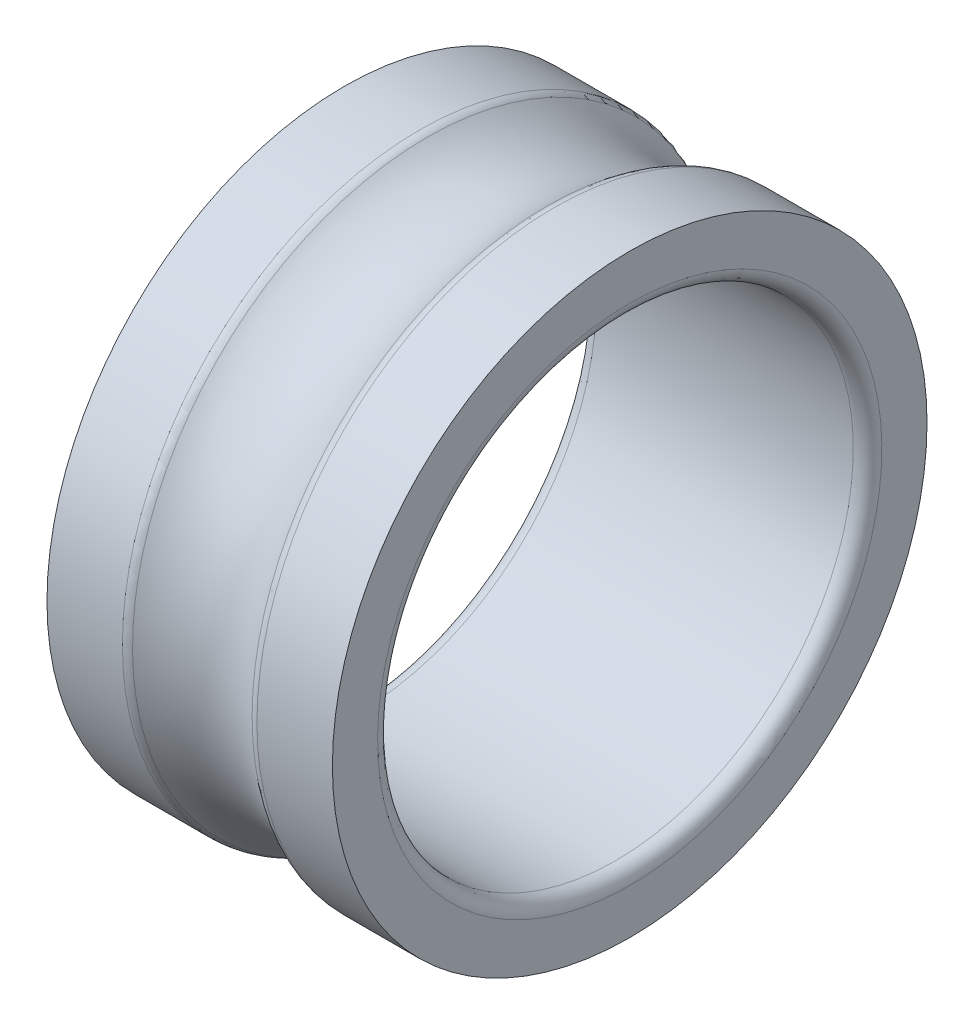
ISO-10303-21;
HEADER;
FILE_DESCRIPTION(('STEP AP214'),'2;1');
FILE_NAME('part.step','',(''),(''),'','','');
FILE_SCHEMA(('AUTOMOTIVE_DESIGN { 1 0 10303 214 1 1 1 1 }'));
ENDSEC;
DATA;
#1=APPLICATION_CONTEXT('core data for automotive mechanical design processes');
#2=APPLICATION_PROTOCOL_DEFINITION('international standard','automotive_design',2000,#1);
#3=PRODUCT_CONTEXT('',#1,'mechanical');
#4=PRODUCT('Part','Part','',(#3));
#5=PRODUCT_RELATED_PRODUCT_CATEGORY('part','',(#4));
#6=PRODUCT_DEFINITION_FORMATION('','',#4);
#7=PRODUCT_DEFINITION_CONTEXT('part definition',#1,'design');
#8=PRODUCT_DEFINITION('design','',#6,#7);
#9=PRODUCT_DEFINITION_SHAPE('','',#8);
#10=(LENGTH_UNIT() NAMED_UNIT(*) SI_UNIT(.MILLI.,.METRE.));
#11=(NAMED_UNIT(*) PLANE_ANGLE_UNIT() SI_UNIT($,.RADIAN.));
#12=(NAMED_UNIT(*) SI_UNIT($,.STERADIAN.) SOLID_ANGLE_UNIT());
#13=UNCERTAINTY_MEASURE_WITH_UNIT(LENGTH_MEASURE(1.E-05),#10,'distance_accuracy_value','');
#14=(GEOMETRIC_REPRESENTATION_CONTEXT(3) GLOBAL_UNCERTAINTY_ASSIGNED_CONTEXT((#13)) GLOBAL_UNIT_ASSIGNED_CONTEXT((#10,
#11,#12)) REPRESENTATION_CONTEXT('',''));
#15=CARTESIAN_POINT('',(0.,0.,0.));
#16=DIRECTION('',(0.,0.,1.));
#17=DIRECTION('',(1.,0.,0.));
#18=AXIS2_PLACEMENT_3D('',#15,#16,#17);
#19=CARTESIAN_POINT('',(0.,0.,0.));
#20=DIRECTION('',(1.,0.,0.));
#21=DIRECTION('',(0.,1.,0.));
#22=AXIS2_PLACEMENT_3D('',#19,#20,#21);
#23=TOROIDAL_SURFACE('',#22,15.5,4.);
#24=CARTESIAN_POINT('',(-2.51415744421884,0.,0.));
#25=DIRECTION('',(1.,0.,0.));
#26=DIRECTION('',(0.,1.,0.));
#27=AXIS2_PLACEMENT_3D('',#24,#25,#26);
#28=CIRCLE('',#27,12.3888888888889);
#29=CARTESIAN_POINT('',(-2.51415744421884,12.3888888888889,0.));
#30=VERTEX_POINT('',#29);
#31=EDGE_CURVE('E57',#30,#30,#28,.T.);
#32=ORIENTED_EDGE('',*,*,#31,.T.);
#33=EDGE_LOOP('',(#32));
#34=FACE_BOUND('',#33,.T.);
#35=CARTESIAN_POINT('',(2.51415744421884,0.,0.));
#36=DIRECTION('',(-1.,0.,0.));
#37=DIRECTION('',(0.,-1.,0.));
#38=AXIS2_PLACEMENT_3D('',#35,#36,#37);
#39=CIRCLE('',#38,12.3888888888889);
#40=CARTESIAN_POINT('',(2.51415744421885,-12.3888888888889,0.));
#41=VERTEX_POINT('',#40);
#42=EDGE_CURVE('E61',#41,#41,#39,.T.);
#43=ORIENTED_EDGE('',*,*,#42,.T.);
#44=EDGE_LOOP('',(#43));
#45=FACE_BOUND('',#44,.T.);
#46=ADVANCED_FACE('F46',(#34,#45),#23,.F.);
#47=CARTESIAN_POINT('',(44.1264439727024,0.,0.));
#48=DIRECTION('',(1.,0.,0.));
#49=DIRECTION('',(0.,1.,0.));
#50=AXIS2_PLACEMENT_3D('',#47,#48,#49);
#51=CYLINDRICAL_SURFACE('',#50,12.5);
#52=CARTESIAN_POINT('',(-2.82842712474619,0.,0.));
#53=DIRECTION('',(-1.,0.,0.));
#54=DIRECTION('',(0.,-1.,0.));
#55=AXIS2_PLACEMENT_3D('',#52,#53,#54);
#56=CIRCLE('',#55,12.5);
#57=CARTESIAN_POINT('',(-2.82842712474618,-12.5,0.));
#58=VERTEX_POINT('',#57);
#59=EDGE_CURVE('E53',#58,#58,#56,.T.);
#60=ORIENTED_EDGE('',*,*,#59,.T.);
#61=EDGE_LOOP('',(#60));
#62=FACE_BOUND('',#61,.T.);
#63=CARTESIAN_POINT('',(-6.,0.,0.));
#64=DIRECTION('',(1.,0.,0.));
#65=DIRECTION('',(0.,1.,0.));
#66=AXIS2_PLACEMENT_3D('',#63,#64,#65);
#67=CIRCLE('',#66,12.5);
#68=CARTESIAN_POINT('',(-6.,12.5,0.));
#69=VERTEX_POINT('',#68);
#70=EDGE_CURVE('E78',#69,#69,#67,.T.);
#71=ORIENTED_EDGE('',*,*,#70,.T.);
#72=EDGE_LOOP('',(#71));
#73=FACE_BOUND('',#72,.T.);
#74=ADVANCED_FACE('F91',(#62,#73),#51,.T.);
#75=CARTESIAN_POINT('',(-6.,0.,0.));
#76=DIRECTION('',(1.,0.,0.));
#77=DIRECTION('',(0.,1.,0.));
#78=AXIS2_PLACEMENT_3D('',#75,#76,#77);
#79=PLANE('',#78);
#80=CARTESIAN_POINT('',(-6.,0.,0.));
#81=DIRECTION('',(1.,0.,0.));
#82=DIRECTION('',(0.,1.,0.));
#83=AXIS2_PLACEMENT_3D('',#80,#81,#82);
#84=CIRCLE('',#83,10.6);
#85=CARTESIAN_POINT('',(-6.,10.6,0.));
#86=VERTEX_POINT('',#85);
#87=EDGE_CURVE('E66',#86,#86,#84,.T.);
#88=ORIENTED_EDGE('',*,*,#87,.T.);
#89=EDGE_LOOP('',(#88));
#90=FACE_BOUND('',#89,.T.);
#91=ORIENTED_EDGE('',*,*,#70,.F.);
#92=EDGE_LOOP('',(#91));
#93=FACE_BOUND('',#92,.T.);
#94=ADVANCED_FACE('F103',(#90,#93),#79,.F.);
#95=CARTESIAN_POINT('',(44.1264439727024,0.,0.));
#96=DIRECTION('',(1.,0.,0.));
#97=DIRECTION('',(0.,1.,0.));
#98=AXIS2_PLACEMENT_3D('',#95,#96,#97);
#99=CYLINDRICAL_SURFACE('',#98,10.);
#100=CARTESIAN_POINT('',(5.4,0.,0.));
#101=DIRECTION('',(1.,0.,0.));
#102=DIRECTION('',(0.,1.,0.));
#103=AXIS2_PLACEMENT_3D('',#100,#101,#102);
#104=CIRCLE('',#103,10.);
#105=CARTESIAN_POINT('',(5.4,9.99999999999999,0.));
#106=VERTEX_POINT('',#105);
#107=EDGE_CURVE('E72',#106,#106,#104,.T.);
#108=ORIENTED_EDGE('',*,*,#107,.T.);
#109=EDGE_LOOP('',(#108));
#110=FACE_BOUND('',#109,.T.);
#111=CARTESIAN_POINT('',(-5.4,0.,0.));
#112=DIRECTION('',(1.,0.,0.));
#113=DIRECTION('',(0.,1.,0.));
#114=AXIS2_PLACEMENT_3D('',#111,#112,#113);
#115=CIRCLE('',#114,10.);
#116=CARTESIAN_POINT('',(-5.4,9.99999999999999,0.));
#117=VERTEX_POINT('',#116);
#118=EDGE_CURVE('E75',#117,#117,#115,.F.);
#119=ORIENTED_EDGE('',*,*,#118,.T.);
#120=EDGE_LOOP('',(#119));
#121=FACE_BOUND('',#120,.T.);
#122=ADVANCED_FACE('F99',(#110,#121),#99,.F.);
#123=CARTESIAN_POINT('',(6.,0.,0.));
#124=DIRECTION('',(1.,0.,0.));
#125=DIRECTION('',(0.,1.,0.));
#126=AXIS2_PLACEMENT_3D('',#123,#124,#125);
#127=PLANE('',#126);
#128=CARTESIAN_POINT('',(6.,0.,0.));
#129=DIRECTION('',(1.,0.,0.));
#130=DIRECTION('',(0.,1.,0.));
#131=AXIS2_PLACEMENT_3D('',#128,#129,#130);
#132=CIRCLE('',#131,10.6);
#133=CARTESIAN_POINT('',(6.,10.6,0.));
#134=VERTEX_POINT('',#133);
#135=EDGE_CURVE('E69',#134,#134,#132,.F.);
#136=ORIENTED_EDGE('',*,*,#135,.T.);
#137=EDGE_LOOP('',(#136));
#138=FACE_BOUND('',#137,.T.);
#139=CARTESIAN_POINT('',(6.,0.,0.));
#140=DIRECTION('',(1.,0.,0.));
#141=DIRECTION('',(0.,1.,0.));
#142=AXIS2_PLACEMENT_3D('',#139,#140,#141);
#143=CIRCLE('',#142,12.5);
#144=CARTESIAN_POINT('',(6.,12.5,0.));
#145=VERTEX_POINT('',#144);
#146=EDGE_CURVE('E81',#145,#145,#143,.T.);
#147=ORIENTED_EDGE('',*,*,#146,.T.);
#148=EDGE_LOOP('',(#147));
#149=FACE_BOUND('',#148,.T.);
#150=ADVANCED_FACE('F85',(#138,#149),#127,.T.);
#151=CARTESIAN_POINT('',(2.82842712474618,0.,0.));
#152=DIRECTION('',(-1.,0.,0.));
#153=DIRECTION('',(0.,-1.,0.));
#154=AXIS2_PLACEMENT_3D('',#151,#152,#153);
#155=CIRCLE('',#154,12.5);
#156=CARTESIAN_POINT('',(2.82842712474618,-12.5,0.));
#157=VERTEX_POINT('',#156);
#158=EDGE_CURVE('E12',#157,#157,#155,.F.);
#159=ORIENTED_EDGE('',*,*,#158,.T.);
#160=EDGE_LOOP('',(#159));
#161=FACE_BOUND('',#160,.T.);
#162=ORIENTED_EDGE('',*,*,#146,.F.);
#163=EDGE_LOOP('',(#162));
#164=FACE_BOUND('',#163,.T.);
#165=ADVANCED_FACE('F87',(#161,#164),#51,.T.);
#166=CARTESIAN_POINT('',(5.4,0.,0.));
#167=DIRECTION('',(1.,0.,0.));
#168=DIRECTION('',(0.,1.,0.));
#169=AXIS2_PLACEMENT_3D('',#166,#167,#168);
#170=TOROIDAL_SURFACE('',#169,10.6,0.6);
#171=ORIENTED_EDGE('',*,*,#135,.F.);
#172=EDGE_LOOP('',(#171));
#173=FACE_BOUND('',#172,.T.);
#174=ORIENTED_EDGE('',*,*,#107,.F.);
#175=EDGE_LOOP('',(#174));
#176=FACE_BOUND('',#175,.T.);
#177=ADVANCED_FACE('F89',(#173,#176),#170,.T.);
#178=CARTESIAN_POINT('',(-5.4,0.,0.));
#179=DIRECTION('',(1.,0.,0.));
#180=DIRECTION('',(0.,1.,0.));
#181=AXIS2_PLACEMENT_3D('',#178,#179,#180);
#182=TOROIDAL_SURFACE('',#181,10.6,0.6);
#183=ORIENTED_EDGE('',*,*,#118,.F.);
#184=EDGE_LOOP('',(#183));
#185=FACE_BOUND('',#184,.T.);
#186=ORIENTED_EDGE('',*,*,#87,.F.);
#187=EDGE_LOOP('',(#186));
#188=FACE_BOUND('',#187,.T.);
#189=ADVANCED_FACE('F96',(#185,#188),#182,.T.);
#190=CARTESIAN_POINT('',(-2.82842712474619,0.,0.));
#191=DIRECTION('',(-1.,0.,0.));
#192=DIRECTION('',(0.,-1.,0.));
#193=AXIS2_PLACEMENT_3D('',#190,#191,#192);
#194=TOROIDAL_SURFACE('',#193,12.,0.5);
#195=ORIENTED_EDGE('',*,*,#59,.F.);
#196=EDGE_LOOP('',(#195));
#197=FACE_BOUND('',#196,.T.);
#198=ORIENTED_EDGE('',*,*,#31,.F.);
#199=EDGE_LOOP('',(#198));
#200=FACE_BOUND('',#199,.T.);
#201=ADVANCED_FACE('F114',(#197,#200),#194,.T.);
#202=CARTESIAN_POINT('',(2.82842712474618,0.,0.));
#203=DIRECTION('',(-1.,0.,0.));
#204=DIRECTION('',(0.,-1.,0.));
#205=AXIS2_PLACEMENT_3D('',#202,#203,#204);
#206=TOROIDAL_SURFACE('',#205,12.,0.5);
#207=ORIENTED_EDGE('',*,*,#42,.F.);
#208=EDGE_LOOP('',(#207));
#209=FACE_BOUND('',#208,.T.);
#210=ORIENTED_EDGE('',*,*,#158,.F.);
#211=EDGE_LOOP('',(#210));
#212=FACE_BOUND('',#211,.T.);
#213=ADVANCED_FACE('F48',(#209,#212),#206,.T.);
#214=CLOSED_SHELL('',(#46,#74,#94,#122,#150,#165,#177,#189,#201,#213));
#215=MANIFOLD_SOLID_BREP('B2',#214);
#216=ADVANCED_BREP_SHAPE_REPRESENTATION('',(#18,#215),#14);
#217=SHAPE_DEFINITION_REPRESENTATION(#9,#216);
ENDSEC;
END-ISO-10303-21;
